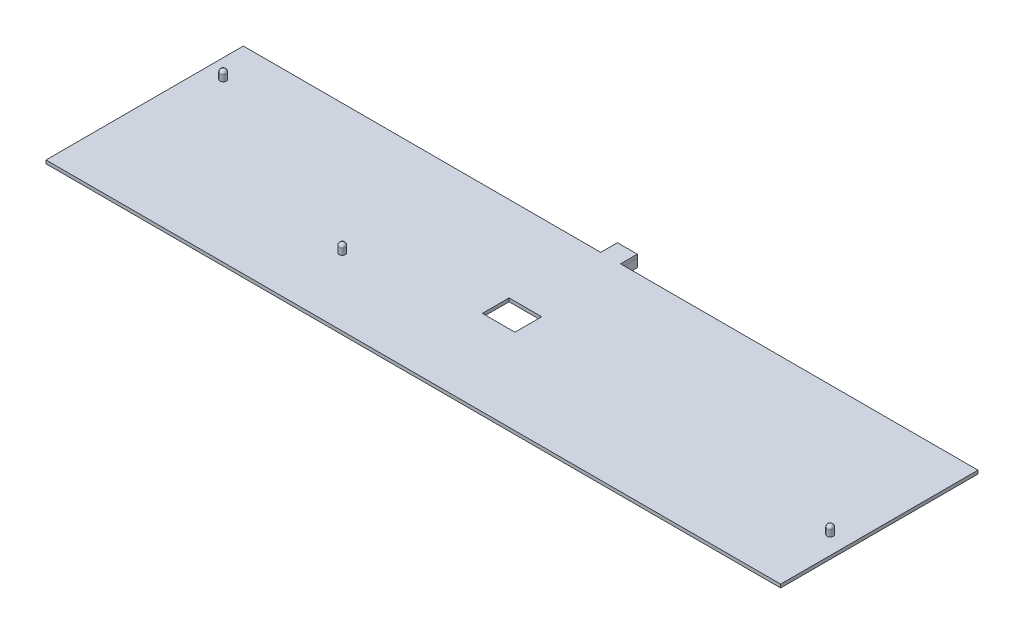
ISO-10303-21;
HEADER;
FILE_DESCRIPTION(('STEP AP214'),'2;1');
FILE_NAME('part.step','',(''),(''),'','','');
FILE_SCHEMA(('AUTOMOTIVE_DESIGN { 1 0 10303 214 1 1 1 1 }'));
ENDSEC;
DATA;
#1=APPLICATION_CONTEXT('core data for automotive mechanical design processes');
#2=APPLICATION_PROTOCOL_DEFINITION('international standard','automotive_design',2000,#1);
#3=PRODUCT_CONTEXT('',#1,'mechanical');
#4=PRODUCT('Part','Part','',(#3));
#5=PRODUCT_RELATED_PRODUCT_CATEGORY('part','',(#4));
#6=PRODUCT_DEFINITION_FORMATION('','',#4);
#7=PRODUCT_DEFINITION_CONTEXT('part definition',#1,'design');
#8=PRODUCT_DEFINITION('design','',#6,#7);
#9=PRODUCT_DEFINITION_SHAPE('','',#8);
#10=(LENGTH_UNIT() NAMED_UNIT(*) SI_UNIT(.MILLI.,.METRE.));
#11=(NAMED_UNIT(*) PLANE_ANGLE_UNIT() SI_UNIT($,.RADIAN.));
#12=(NAMED_UNIT(*) SI_UNIT($,.STERADIAN.) SOLID_ANGLE_UNIT());
#13=UNCERTAINTY_MEASURE_WITH_UNIT(LENGTH_MEASURE(1.E-05),#10,'distance_accuracy_value','');
#14=(GEOMETRIC_REPRESENTATION_CONTEXT(3) GLOBAL_UNCERTAINTY_ASSIGNED_CONTEXT((#13)) GLOBAL_UNIT_ASSIGNED_CONTEXT((#10,
#11,#12)) REPRESENTATION_CONTEXT('',''));
#15=CARTESIAN_POINT('',(0.,0.,0.));
#16=DIRECTION('',(0.,0.,1.));
#17=DIRECTION('',(1.,0.,0.));
#18=AXIS2_PLACEMENT_3D('',#15,#16,#17);
#19=CARTESIAN_POINT('',(4.75000000000005,-5.6,-55.2));
#20=DIRECTION('',(-1.,0.,0.));
#21=DIRECTION('',(0.,0.,1.));
#22=AXIS2_PLACEMENT_3D('',#19,#20,#21);
#23=PLANE('',#22);
#24=DIRECTION('',(0.,0.,1.));
#25=VECTOR('',#24,1.);
#26=CARTESIAN_POINT('',(4.75000000000005,-1.6,-55.2));
#27=LINE('',#26,#25);
#28=CARTESIAN_POINT('',(4.75000000000005,-1.6,-55.2));
#29=VERTEX_POINT('',#28);
#30=CARTESIAN_POINT('',(4.75000000000005,-1.6,-47.2));
#31=VERTEX_POINT('',#30);
#32=EDGE_CURVE('E108',#29,#31,#27,.T.);
#33=ORIENTED_EDGE('',*,*,#32,.T.);
#34=DIRECTION('',(0.,1.,0.));
#35=VECTOR('',#34,1.);
#36=CARTESIAN_POINT('',(4.75000000000005,-5.6,-47.2));
#37=LINE('',#36,#35);
#38=CARTESIAN_POINT('',(4.75000000000005,-5.6,-47.2));
#39=VERTEX_POINT('',#38);
#40=EDGE_CURVE('E12',#39,#31,#37,.T.);
#41=ORIENTED_EDGE('',*,*,#40,.F.);
#42=DIRECTION('',(0.,0.,1.));
#43=VECTOR('',#42,1.);
#44=CARTESIAN_POINT('',(4.75000000000005,-5.6,-55.2));
#45=LINE('',#44,#43);
#46=CARTESIAN_POINT('',(4.75000000000005,-5.6,-55.2));
#47=VERTEX_POINT('',#46);
#48=EDGE_CURVE('E96',#47,#39,#45,.T.);
#49=ORIENTED_EDGE('',*,*,#48,.F.);
#50=DIRECTION('',(0.,1.,0.));
#51=VECTOR('',#50,1.);
#52=CARTESIAN_POINT('',(4.75000000000005,-5.6,-55.2));
#53=LINE('',#52,#51);
#54=EDGE_CURVE('E104',#47,#29,#53,.T.);
#55=ORIENTED_EDGE('',*,*,#54,.T.);
#56=EDGE_LOOP('',(#33,#41,#49,#55));
#57=FACE_BOUND('',#56,.T.);
#58=ADVANCED_FACE('F45',(#57),#23,.F.);
#59=CARTESIAN_POINT('',(4.75000000000005,-5.6,-47.2));
#60=DIRECTION('',(0.,0.,-1.));
#61=DIRECTION('',(0.,1.,0.));
#62=AXIS2_PLACEMENT_3D('',#59,#60,#61);
#63=PLANE('',#62);
#64=DIRECTION('',(-1.,0.,0.));
#65=VECTOR('',#64,1.);
#66=CARTESIAN_POINT('',(4.75000000000005,-1.6,-47.2));
#67=LINE('',#66,#65);
#68=CARTESIAN_POINT('',(-4.74999999999995,-1.6,-47.2));
#69=VERTEX_POINT('',#68);
#70=EDGE_CURVE('E100',#31,#69,#67,.T.);
#71=ORIENTED_EDGE('',*,*,#70,.T.);
#72=DIRECTION('',(0.,1.,0.));
#73=VECTOR('',#72,1.);
#74=CARTESIAN_POINT('',(-4.74999999999995,-5.6,-47.2));
#75=LINE('',#74,#73);
#76=CARTESIAN_POINT('',(-4.74999999999995,-5.6,-47.2));
#77=VERTEX_POINT('',#76);
#78=EDGE_CURVE('E53',#77,#69,#75,.T.);
#79=ORIENTED_EDGE('',*,*,#78,.F.);
#80=DIRECTION('',(-1.,0.,0.));
#81=VECTOR('',#80,1.);
#82=CARTESIAN_POINT('',(4.75000000000005,-5.6,-47.2));
#83=LINE('',#82,#81);
#84=EDGE_CURVE('E91',#39,#77,#83,.T.);
#85=ORIENTED_EDGE('',*,*,#84,.F.);
#86=ORIENTED_EDGE('',*,*,#40,.T.);
#87=EDGE_LOOP('',(#71,#79,#85,#86));
#88=FACE_BOUND('',#87,.T.);
#89=ADVANCED_FACE('F99',(#88),#63,.F.);
#90=CARTESIAN_POINT('',(-4.74999999999995,-5.6,-47.2));
#91=DIRECTION('',(1.,0.,0.));
#92=DIRECTION('',(0.,0.,-1.));
#93=AXIS2_PLACEMENT_3D('',#90,#91,#92);
#94=PLANE('',#93);
#95=DIRECTION('',(0.,0.,-1.));
#96=VECTOR('',#95,1.);
#97=CARTESIAN_POINT('',(-4.74999999999995,-1.6,-47.2));
#98=LINE('',#97,#96);
#99=CARTESIAN_POINT('',(-4.74999999999995,-1.6,-55.2));
#100=VERTEX_POINT('',#99);
#101=EDGE_CURVE('E78',#69,#100,#98,.T.);
#102=ORIENTED_EDGE('',*,*,#101,.T.);
#103=DIRECTION('',(0.,1.,0.));
#104=VECTOR('',#103,1.);
#105=CARTESIAN_POINT('',(-4.74999999999995,-5.6,-55.2));
#106=LINE('',#105,#104);
#107=CARTESIAN_POINT('',(-4.74999999999995,-5.6,-55.2));
#108=VERTEX_POINT('',#107);
#109=EDGE_CURVE('E101',#108,#100,#106,.T.);
#110=ORIENTED_EDGE('',*,*,#109,.F.);
#111=DIRECTION('',(0.,0.,-1.));
#112=VECTOR('',#111,1.);
#113=CARTESIAN_POINT('',(-4.74999999999995,-5.6,-47.2));
#114=LINE('',#113,#112);
#115=EDGE_CURVE('E94',#77,#108,#114,.T.);
#116=ORIENTED_EDGE('',*,*,#115,.F.);
#117=ORIENTED_EDGE('',*,*,#78,.T.);
#118=EDGE_LOOP('',(#102,#110,#116,#117));
#119=FACE_BOUND('',#118,.T.);
#120=ADVANCED_FACE('F102',(#119),#94,.F.);
#121=CARTESIAN_POINT('',(-4.74999999999995,-5.6,-55.2));
#122=DIRECTION('',(0.,0.,1.));
#123=DIRECTION('',(0.,-1.,0.));
#124=AXIS2_PLACEMENT_3D('',#121,#122,#123);
#125=PLANE('',#124);
#126=DIRECTION('',(1.,0.,0.));
#127=VECTOR('',#126,1.);
#128=CARTESIAN_POINT('',(-4.74999999999995,-1.6,-55.2));
#129=LINE('',#128,#127);
#130=EDGE_CURVE('E84',#100,#29,#129,.T.);
#131=ORIENTED_EDGE('',*,*,#130,.T.);
#132=ORIENTED_EDGE('',*,*,#54,.F.);
#133=DIRECTION('',(1.,0.,0.));
#134=VECTOR('',#133,1.);
#135=CARTESIAN_POINT('',(-4.74999999999995,-5.6,-55.2));
#136=LINE('',#135,#134);
#137=EDGE_CURVE('E61',#108,#47,#136,.T.);
#138=ORIENTED_EDGE('',*,*,#137,.F.);
#139=ORIENTED_EDGE('',*,*,#109,.T.);
#140=EDGE_LOOP('',(#131,#132,#138,#139));
#141=FACE_BOUND('',#140,.T.);
#142=ADVANCED_FACE('F115',(#141),#125,.F.);
#143=CARTESIAN_POINT('',(0.,-5.6,0.));
#144=DIRECTION('',(0.,-1.,0.));
#145=DIRECTION('',(0.,0.,-1.));
#146=AXIS2_PLACEMENT_3D('',#143,#144,#145);
#147=PLANE('',#146);
#148=ORIENTED_EDGE('',*,*,#48,.T.);
#149=ORIENTED_EDGE('',*,*,#84,.T.);
#150=ORIENTED_EDGE('',*,*,#115,.T.);
#151=ORIENTED_EDGE('',*,*,#137,.T.);
#152=EDGE_LOOP('',(#148,#149,#150,#151));
#153=FACE_BOUND('',#152,.T.);
#154=ADVANCED_FACE('F92',(#153),#147,.T.);
#155=CARTESIAN_POINT('',(0.,-1.6,0.));
#156=DIRECTION('',(0.,-1.,0.));
#157=DIRECTION('',(0.,0.,-1.));
#158=AXIS2_PLACEMENT_3D('',#155,#156,#157);
#159=PLANE('',#158);
#160=ORIENTED_EDGE('',*,*,#32,.F.);
#161=ORIENTED_EDGE('',*,*,#130,.F.);
#162=ORIENTED_EDGE('',*,*,#101,.F.);
#163=ORIENTED_EDGE('',*,*,#70,.F.);
#164=EDGE_LOOP('',(#160,#161,#162,#163));
#165=FACE_BOUND('',#164,.T.);
#166=ADVANCED_FACE('F118',(#165),#159,.F.);
#167=CLOSED_SHELL('',(#58,#89,#120,#142,#154,#166));
#168=MANIFOLD_SOLID_BREP('B2',#167);
#169=CARTESIAN_POINT('',(4.75000000000005,-1.6,-47.2));
#170=DIRECTION('',(0.,0.,-1.));
#171=DIRECTION('',(-1.,0.,0.));
#172=AXIS2_PLACEMENT_3D('',#169,#170,#171);
#173=PLANE('',#172);
#174=DIRECTION('',(-1.,0.,0.));
#175=VECTOR('',#174,1.);
#176=CARTESIAN_POINT('',(4.75000000000005,0.,-47.2));
#177=LINE('',#176,#175);
#178=CARTESIAN_POINT('',(175.7,0.,-47.2));
#179=VERTEX_POINT('',#178);
#180=CARTESIAN_POINT('',(4.75000000000005,0.,-47.2));
#181=VERTEX_POINT('',#180);
#182=EDGE_CURVE('E296',#179,#181,#177,.T.);
#183=ORIENTED_EDGE('',*,*,#182,.F.);
#184=DIRECTION('',(0.,1.,0.));
#185=VECTOR('',#184,1.);
#186=CARTESIAN_POINT('',(175.7,-1.6,-47.2));
#187=LINE('',#186,#185);
#188=CARTESIAN_POINT('',(175.7,-1.6,-47.2));
#189=VERTEX_POINT('',#188);
#190=EDGE_CURVE('E43',#189,#179,#187,.T.);
#191=ORIENTED_EDGE('',*,*,#190,.F.);
#192=DIRECTION('',(-1.,0.,0.));
#193=VECTOR('',#192,1.);
#194=CARTESIAN_POINT('',(4.75000000000005,-1.6,-47.2));
#195=LINE('',#194,#193);
#196=CARTESIAN_POINT('',(4.75000000000005,-1.6,-47.2));
#197=VERTEX_POINT('',#196);
#198=EDGE_CURVE('E300',#189,#197,#195,.T.);
#199=ORIENTED_EDGE('',*,*,#198,.T.);
#200=DIRECTION('',(0.,1.,0.));
#201=VECTOR('',#200,1.);
#202=CARTESIAN_POINT('',(4.75000000000005,-1.6,-47.2));
#203=LINE('',#202,#201);
#204=EDGE_CURVE('E325',#197,#181,#203,.T.);
#205=ORIENTED_EDGE('',*,*,#204,.T.);
#206=EDGE_LOOP('',(#183,#191,#199,#205));
#207=FACE_BOUND('',#206,.T.);
#208=ADVANCED_FACE('F169',(#207),#173,.T.);
#209=CARTESIAN_POINT('',(175.7,-1.6,47.2));
#210=DIRECTION('',(1.,0.,0.));
#211=DIRECTION('',(0.,0.,-1.));
#212=AXIS2_PLACEMENT_3D('',#209,#210,#211);
#213=PLANE('',#212);
#214=DIRECTION('',(0.,0.,-1.));
#215=VECTOR('',#214,1.);
#216=CARTESIAN_POINT('',(175.7,0.,47.2));
#217=LINE('',#216,#215);
#218=CARTESIAN_POINT('',(175.7,0.,47.2));
#219=VERTEX_POINT('',#218);
#220=EDGE_CURVE('E304',#219,#179,#217,.T.);
#221=ORIENTED_EDGE('',*,*,#220,.F.);
#222=DIRECTION('',(0.,1.,0.));
#223=VECTOR('',#222,1.);
#224=CARTESIAN_POINT('',(175.7,-1.6,47.2));
#225=LINE('',#224,#223);
#226=CARTESIAN_POINT('',(175.7,-1.6,47.2));
#227=VERTEX_POINT('',#226);
#228=EDGE_CURVE('E178',#227,#219,#225,.T.);
#229=ORIENTED_EDGE('',*,*,#228,.F.);
#230=DIRECTION('',(0.,0.,-1.));
#231=VECTOR('',#230,1.);
#232=CARTESIAN_POINT('',(175.7,-1.6,47.2));
#233=LINE('',#232,#231);
#234=EDGE_CURVE('E322',#227,#189,#233,.T.);
#235=ORIENTED_EDGE('',*,*,#234,.T.);
#236=ORIENTED_EDGE('',*,*,#190,.T.);
#237=EDGE_LOOP('',(#221,#229,#235,#236));
#238=FACE_BOUND('',#237,.T.);
#239=ADVANCED_FACE('F414',(#238),#213,.T.);
#240=CARTESIAN_POINT('',(-175.7,-1.6,47.2));
#241=DIRECTION('',(0.,0.,1.));
#242=DIRECTION('',(1.,0.,0.));
#243=AXIS2_PLACEMENT_3D('',#240,#241,#242);
#244=PLANE('',#243);
#245=DIRECTION('',(1.,0.,0.));
#246=VECTOR('',#245,1.);
#247=CARTESIAN_POINT('',(-175.7,0.,47.2));
#248=LINE('',#247,#246);
#249=CARTESIAN_POINT('',(-175.7,0.,47.2));
#250=VERTEX_POINT('',#249);
#251=EDGE_CURVE('E343',#250,#219,#248,.T.);
#252=ORIENTED_EDGE('',*,*,#251,.F.);
#253=DIRECTION('',(0.,1.,0.));
#254=VECTOR('',#253,1.);
#255=CARTESIAN_POINT('',(-175.7,-1.6,47.2));
#256=LINE('',#255,#254);
#257=CARTESIAN_POINT('',(-175.7,-1.6,47.2));
#258=VERTEX_POINT('',#257);
#259=EDGE_CURVE('E349',#258,#250,#256,.T.);
#260=ORIENTED_EDGE('',*,*,#259,.F.);
#261=DIRECTION('',(1.,0.,0.));
#262=VECTOR('',#261,1.);
#263=CARTESIAN_POINT('',(-175.7,-1.6,47.2));
#264=LINE('',#263,#262);
#265=EDGE_CURVE('E319',#258,#227,#264,.T.);
#266=ORIENTED_EDGE('',*,*,#265,.T.);
#267=ORIENTED_EDGE('',*,*,#228,.T.);
#268=EDGE_LOOP('',(#252,#260,#266,#267));
#269=FACE_BOUND('',#268,.T.);
#270=ADVANCED_FACE('F417',(#269),#244,.T.);
#271=CARTESIAN_POINT('',(-175.7,-1.6,47.2));
#272=DIRECTION('',(-1.,0.,0.));
#273=DIRECTION('',(0.,0.,1.));
#274=AXIS2_PLACEMENT_3D('',#271,#272,#273);
#275=PLANE('',#274);
#276=DIRECTION('',(0.,0.,1.));
#277=VECTOR('',#276,1.);
#278=CARTESIAN_POINT('',(-175.7,0.,47.2));
#279=LINE('',#278,#277);
#280=CARTESIAN_POINT('',(-175.7,0.,-47.2));
#281=VERTEX_POINT('',#280);
#282=EDGE_CURVE('E340',#281,#250,#279,.T.);
#283=ORIENTED_EDGE('',*,*,#282,.F.);
#284=DIRECTION('',(0.,1.,0.));
#285=VECTOR('',#284,1.);
#286=CARTESIAN_POINT('',(-175.7,-1.6,-47.2));
#287=LINE('',#286,#285);
#288=CARTESIAN_POINT('',(-175.7,-1.6,-47.2));
#289=VERTEX_POINT('',#288);
#290=EDGE_CURVE('E351',#289,#281,#287,.T.);
#291=ORIENTED_EDGE('',*,*,#290,.F.);
#292=DIRECTION('',(0.,0.,1.));
#293=VECTOR('',#292,1.);
#294=CARTESIAN_POINT('',(-175.7,-1.6,47.2));
#295=LINE('',#294,#293);
#296=EDGE_CURVE('E316',#289,#258,#295,.T.);
#297=ORIENTED_EDGE('',*,*,#296,.T.);
#298=ORIENTED_EDGE('',*,*,#259,.T.);
#299=EDGE_LOOP('',(#283,#291,#297,#298));
#300=FACE_BOUND('',#299,.T.);
#301=ADVANCED_FACE('F410',(#300),#275,.T.);
#302=CARTESIAN_POINT('',(-175.7,-1.6,-47.2));
#303=DIRECTION('',(0.,0.,-1.));
#304=DIRECTION('',(-1.,0.,0.));
#305=AXIS2_PLACEMENT_3D('',#302,#303,#304);
#306=PLANE('',#305);
#307=DIRECTION('',(-1.,0.,0.));
#308=VECTOR('',#307,1.);
#309=CARTESIAN_POINT('',(-175.7,0.,-47.2));
#310=LINE('',#309,#308);
#311=CARTESIAN_POINT('',(-4.74999999999995,0.,-47.2));
#312=VERTEX_POINT('',#311);
#313=EDGE_CURVE('E337',#312,#281,#310,.T.);
#314=ORIENTED_EDGE('',*,*,#313,.F.);
#315=DIRECTION('',(0.,1.,0.));
#316=VECTOR('',#315,1.);
#317=CARTESIAN_POINT('',(-4.74999999999995,-1.6,-47.2));
#318=LINE('',#317,#316);
#319=CARTESIAN_POINT('',(-4.74999999999995,-1.6,-47.2));
#320=VERTEX_POINT('',#319);
#321=EDGE_CURVE('E353',#320,#312,#318,.T.);
#322=ORIENTED_EDGE('',*,*,#321,.F.);
#323=DIRECTION('',(-1.,0.,0.));
#324=VECTOR('',#323,1.);
#325=CARTESIAN_POINT('',(-175.7,-1.6,-47.2));
#326=LINE('',#325,#324);
#327=EDGE_CURVE('E313',#320,#289,#326,.T.);
#328=ORIENTED_EDGE('',*,*,#327,.T.);
#329=ORIENTED_EDGE('',*,*,#290,.T.);
#330=EDGE_LOOP('',(#314,#322,#328,#329));
#331=FACE_BOUND('',#330,.T.);
#332=ADVANCED_FACE('F406',(#331),#306,.T.);
#333=CARTESIAN_POINT('',(-4.74999999999995,-1.6,-47.2));
#334=DIRECTION('',(-1.,0.,0.));
#335=DIRECTION('',(0.,0.,1.));
#336=AXIS2_PLACEMENT_3D('',#333,#334,#335);
#337=PLANE('',#336);
#338=DIRECTION('',(0.,0.,1.));
#339=VECTOR('',#338,1.);
#340=CARTESIAN_POINT('',(-4.74999999999995,0.,-47.2));
#341=LINE('',#340,#339);
#342=CARTESIAN_POINT('',(-4.74999999999995,0.,-55.2));
#343=VERTEX_POINT('',#342);
#344=EDGE_CURVE('E334',#343,#312,#341,.T.);
#345=ORIENTED_EDGE('',*,*,#344,.F.);
#346=DIRECTION('',(0.,1.,0.));
#347=VECTOR('',#346,1.);
#348=CARTESIAN_POINT('',(-4.74999999999995,-1.6,-55.2));
#349=LINE('',#348,#347);
#350=CARTESIAN_POINT('',(-4.74999999999995,-1.6,-55.2));
#351=VERTEX_POINT('',#350);
#352=EDGE_CURVE('E355',#351,#343,#349,.T.);
#353=ORIENTED_EDGE('',*,*,#352,.F.);
#354=DIRECTION('',(0.,0.,1.));
#355=VECTOR('',#354,1.);
#356=CARTESIAN_POINT('',(-4.74999999999995,-1.6,-47.2));
#357=LINE('',#356,#355);
#358=EDGE_CURVE('E310',#351,#320,#357,.T.);
#359=ORIENTED_EDGE('',*,*,#358,.T.);
#360=ORIENTED_EDGE('',*,*,#321,.T.);
#361=EDGE_LOOP('',(#345,#353,#359,#360));
#362=FACE_BOUND('',#361,.T.);
#363=ADVANCED_FACE('F402',(#362),#337,.T.);
#364=CARTESIAN_POINT('',(-4.74999999999995,-1.6,-55.2));
#365=DIRECTION('',(0.,0.,-1.));
#366=DIRECTION('',(-1.,0.,0.));
#367=AXIS2_PLACEMENT_3D('',#364,#365,#366);
#368=PLANE('',#367);
#369=DIRECTION('',(-1.,0.,0.));
#370=VECTOR('',#369,1.);
#371=CARTESIAN_POINT('',(-4.74999999999995,0.,-55.2));
#372=LINE('',#371,#370);
#373=CARTESIAN_POINT('',(4.75000000000005,0.,-55.2));
#374=VERTEX_POINT('',#373);
#375=EDGE_CURVE('E331',#374,#343,#372,.T.);
#376=ORIENTED_EDGE('',*,*,#375,.F.);
#377=DIRECTION('',(0.,1.,0.));
#378=VECTOR('',#377,1.);
#379=CARTESIAN_POINT('',(4.75000000000005,-1.6,-55.2));
#380=LINE('',#379,#378);
#381=CARTESIAN_POINT('',(4.75000000000005,-1.6,-55.2));
#382=VERTEX_POINT('',#381);
#383=EDGE_CURVE('E357',#382,#374,#380,.T.);
#384=ORIENTED_EDGE('',*,*,#383,.F.);
#385=DIRECTION('',(-1.,0.,0.));
#386=VECTOR('',#385,1.);
#387=CARTESIAN_POINT('',(-4.74999999999995,-1.6,-55.2));
#388=LINE('',#387,#386);
#389=EDGE_CURVE('E307',#382,#351,#388,.T.);
#390=ORIENTED_EDGE('',*,*,#389,.T.);
#391=ORIENTED_EDGE('',*,*,#352,.T.);
#392=EDGE_LOOP('',(#376,#384,#390,#391));
#393=FACE_BOUND('',#392,.T.);
#394=ADVANCED_FACE('F398',(#393),#368,.T.);
#395=CARTESIAN_POINT('',(4.75000000000005,-1.6,-47.2));
#396=DIRECTION('',(1.,0.,0.));
#397=DIRECTION('',(0.,0.,-1.));
#398=AXIS2_PLACEMENT_3D('',#395,#396,#397);
#399=PLANE('',#398);
#400=DIRECTION('',(0.,0.,-1.));
#401=VECTOR('',#400,1.);
#402=CARTESIAN_POINT('',(4.75000000000005,0.,-47.2));
#403=LINE('',#402,#401);
#404=EDGE_CURVE('E328',#181,#374,#403,.T.);
#405=ORIENTED_EDGE('',*,*,#404,.F.);
#406=ORIENTED_EDGE('',*,*,#204,.F.);
#407=DIRECTION('',(0.,0.,-1.));
#408=VECTOR('',#407,1.);
#409=CARTESIAN_POINT('',(4.75000000000005,-1.6,-47.2));
#410=LINE('',#409,#408);
#411=EDGE_CURVE('E303',#197,#382,#410,.T.);
#412=ORIENTED_EDGE('',*,*,#411,.T.);
#413=ORIENTED_EDGE('',*,*,#383,.T.);
#414=EDGE_LOOP('',(#405,#406,#412,#413));
#415=FACE_BOUND('',#414,.T.);
#416=ADVANCED_FACE('F394',(#415),#399,.T.);
#417=CARTESIAN_POINT('',(0.,-1.6,0.));
#418=DIRECTION('',(0.,1.,0.));
#419=DIRECTION('',(0.,0.,1.));
#420=AXIS2_PLACEMENT_3D('',#417,#418,#419);
#421=PLANE('',#420);
#422=DIRECTION('',(1.,0.,0.));
#423=VECTOR('',#422,1.);
#424=CARTESIAN_POINT('',(-7.79999999999995,-1.6,6.4));
#425=LINE('',#424,#423);
#426=CARTESIAN_POINT('',(-7.79999999999995,-1.6,6.4));
#427=VERTEX_POINT('',#426);
#428=CARTESIAN_POINT('',(7.80000000000005,-1.6,6.4));
#429=VERTEX_POINT('',#428);
#430=EDGE_CURVE('E267',#427,#429,#425,.T.);
#431=ORIENTED_EDGE('',*,*,#430,.T.);
#432=DIRECTION('',(0.,0.,-1.));
#433=VECTOR('',#432,1.);
#434=CARTESIAN_POINT('',(7.80000000000005,-1.6,6.4));
#435=LINE('',#434,#433);
#436=CARTESIAN_POINT('',(7.80000000000005,-1.6,-6.4));
#437=VERTEX_POINT('',#436);
#438=EDGE_CURVE('E261',#429,#437,#435,.T.);
#439=ORIENTED_EDGE('',*,*,#438,.T.);
#440=DIRECTION('',(-1.,0.,0.));
#441=VECTOR('',#440,1.);
#442=CARTESIAN_POINT('',(-7.79999999999995,-1.6,-6.4));
#443=LINE('',#442,#441);
#444=CARTESIAN_POINT('',(-7.79999999999995,-1.6,-6.4));
#445=VERTEX_POINT('',#444);
#446=EDGE_CURVE('E270',#437,#445,#443,.T.);
#447=ORIENTED_EDGE('',*,*,#446,.T.);
#448=DIRECTION('',(0.,0.,1.));
#449=VECTOR('',#448,1.);
#450=CARTESIAN_POINT('',(-7.79999999999995,-1.6,6.4));
#451=LINE('',#450,#449);
#452=EDGE_CURVE('E186',#445,#427,#451,.T.);
#453=ORIENTED_EDGE('',*,*,#452,.T.);
#454=EDGE_LOOP('',(#431,#439,#447,#453));
#455=FACE_BOUND('',#454,.T.);
#456=ORIENTED_EDGE('',*,*,#198,.F.);
#457=ORIENTED_EDGE('',*,*,#234,.F.);
#458=ORIENTED_EDGE('',*,*,#265,.F.);
#459=ORIENTED_EDGE('',*,*,#296,.F.);
#460=ORIENTED_EDGE('',*,*,#327,.F.);
#461=ORIENTED_EDGE('',*,*,#358,.F.);
#462=ORIENTED_EDGE('',*,*,#389,.F.);
#463=ORIENTED_EDGE('',*,*,#411,.F.);
#464=EDGE_LOOP('',(#456,#457,#458,#459,#460,#461,#462,#463));
#465=FACE_BOUND('',#464,.T.);
#466=ADVANCED_FACE('F274',(#455,#465),#421,.F.);
#467=CARTESIAN_POINT('',(0.,0.,0.));
#468=DIRECTION('',(0.,1.,0.));
#469=DIRECTION('',(0.,0.,1.));
#470=AXIS2_PLACEMENT_3D('',#467,#468,#469);
#471=PLANE('',#470);
#472=CARTESIAN_POINT('',(166.981249999994,0.,14.7999999999999));
#473=DIRECTION('',(0.,1.,0.));
#474=DIRECTION('',(0.,0.,1.));
#475=AXIS2_PLACEMENT_3D('',#472,#473,#474);
#476=CIRCLE('',#475,1.5);
#477=CARTESIAN_POINT('',(166.981249999994,0.,16.2999999999999));
#478=VERTEX_POINT('',#477);
#479=EDGE_CURVE('E371',#478,#478,#476,.T.);
#480=ORIENTED_EDGE('',*,*,#479,.F.);
#481=EDGE_LOOP('',(#480));
#482=FACE_BOUND('',#481,.T.);
#483=CARTESIAN_POINT('',(-66.381250000005,0.,14.7999999999999));
#484=DIRECTION('',(0.,1.,0.));
#485=DIRECTION('',(0.,0.,1.));
#486=AXIS2_PLACEMENT_3D('',#483,#484,#485);
#487=CIRCLE('',#486,1.5);
#488=CARTESIAN_POINT('',(-66.381250000005,0.,16.2999999999999));
#489=VERTEX_POINT('',#488);
#490=EDGE_CURVE('E363',#489,#489,#487,.T.);
#491=ORIENTED_EDGE('',*,*,#490,.F.);
#492=EDGE_LOOP('',(#491));
#493=FACE_BOUND('',#492,.T.);
#494=CARTESIAN_POINT('',(-166.737500000004,0.,-28.5750000000002));
#495=DIRECTION('',(0.,1.,0.));
#496=DIRECTION('',(0.,0.,1.));
#497=AXIS2_PLACEMENT_3D('',#494,#495,#496);
#498=CIRCLE('',#497,1.5);
#499=CARTESIAN_POINT('',(-166.737500000004,0.,-27.0750000000002));
#500=VERTEX_POINT('',#499);
#501=EDGE_CURVE('E283',#500,#500,#498,.T.);
#502=ORIENTED_EDGE('',*,*,#501,.F.);
#503=EDGE_LOOP('',(#502));
#504=FACE_BOUND('',#503,.T.);
#505=DIRECTION('',(0.,0.,-1.));
#506=VECTOR('',#505,1.);
#507=CARTESIAN_POINT('',(7.80000000000005,0.,6.4));
#508=LINE('',#507,#506);
#509=CARTESIAN_POINT('',(7.80000000000005,0.,6.4));
#510=VERTEX_POINT('',#509);
#511=CARTESIAN_POINT('',(7.80000000000005,0.,-6.4));
#512=VERTEX_POINT('',#511);
#513=EDGE_CURVE('E194',#510,#512,#508,.T.);
#514=ORIENTED_EDGE('',*,*,#513,.F.);
#515=DIRECTION('',(1.,0.,0.));
#516=VECTOR('',#515,1.);
#517=CARTESIAN_POINT('',(-7.79999999999995,0.,6.4));
#518=LINE('',#517,#516);
#519=CARTESIAN_POINT('',(-7.79999999999995,0.,6.4));
#520=VERTEX_POINT('',#519);
#521=EDGE_CURVE('E277',#520,#510,#518,.T.);
#522=ORIENTED_EDGE('',*,*,#521,.F.);
#523=DIRECTION('',(0.,0.,1.));
#524=VECTOR('',#523,1.);
#525=CARTESIAN_POINT('',(-7.79999999999995,0.,6.4));
#526=LINE('',#525,#524);
#527=CARTESIAN_POINT('',(-7.79999999999995,0.,-6.4));
#528=VERTEX_POINT('',#527);
#529=EDGE_CURVE('E280',#528,#520,#526,.T.);
#530=ORIENTED_EDGE('',*,*,#529,.F.);
#531=DIRECTION('',(-1.,0.,0.));
#532=VECTOR('',#531,1.);
#533=CARTESIAN_POINT('',(-7.79999999999995,0.,-6.4));
#534=LINE('',#533,#532);
#535=EDGE_CURVE('E289',#512,#528,#534,.T.);
#536=ORIENTED_EDGE('',*,*,#535,.F.);
#537=EDGE_LOOP('',(#514,#522,#530,#536));
#538=FACE_BOUND('',#537,.T.);
#539=ORIENTED_EDGE('',*,*,#182,.T.);
#540=ORIENTED_EDGE('',*,*,#404,.T.);
#541=ORIENTED_EDGE('',*,*,#375,.T.);
#542=ORIENTED_EDGE('',*,*,#344,.T.);
#543=ORIENTED_EDGE('',*,*,#313,.T.);
#544=ORIENTED_EDGE('',*,*,#282,.T.);
#545=ORIENTED_EDGE('',*,*,#251,.T.);
#546=ORIENTED_EDGE('',*,*,#220,.T.);
#547=EDGE_LOOP('',(#539,#540,#541,#542,#543,#544,#545,#546));
#548=FACE_BOUND('',#547,.T.);
#549=ADVANCED_FACE('F378',(#482,#493,#504,#538,#548),#471,.T.);
#550=CARTESIAN_POINT('',(7.80000000000005,-1.6,6.4));
#551=DIRECTION('',(1.,0.,0.));
#552=DIRECTION('',(0.,0.,-1.));
#553=AXIS2_PLACEMENT_3D('',#550,#551,#552);
#554=PLANE('',#553);
#555=ORIENTED_EDGE('',*,*,#513,.T.);
#556=DIRECTION('',(0.,1.,0.));
#557=VECTOR('',#556,1.);
#558=CARTESIAN_POINT('',(7.80000000000005,-1.6,-6.4));
#559=LINE('',#558,#557);
#560=EDGE_CURVE('E257',#437,#512,#559,.T.);
#561=ORIENTED_EDGE('',*,*,#560,.F.);
#562=ORIENTED_EDGE('',*,*,#438,.F.);
#563=DIRECTION('',(0.,1.,0.));
#564=VECTOR('',#563,1.);
#565=CARTESIAN_POINT('',(7.80000000000005,-1.6,6.4));
#566=LINE('',#565,#564);
#567=EDGE_CURVE('E294',#429,#510,#566,.T.);
#568=ORIENTED_EDGE('',*,*,#567,.T.);
#569=EDGE_LOOP('',(#555,#561,#562,#568));
#570=FACE_BOUND('',#569,.T.);
#571=ADVANCED_FACE('F259',(#570),#554,.F.);
#572=CARTESIAN_POINT('',(-7.79999999999995,-1.6,6.4));
#573=DIRECTION('',(0.,0.,1.));
#574=DIRECTION('',(1.,0.,0.));
#575=AXIS2_PLACEMENT_3D('',#572,#573,#574);
#576=PLANE('',#575);
#577=ORIENTED_EDGE('',*,*,#521,.T.);
#578=ORIENTED_EDGE('',*,*,#567,.F.);
#579=ORIENTED_EDGE('',*,*,#430,.F.);
#580=DIRECTION('',(0.,1.,0.));
#581=VECTOR('',#580,1.);
#582=CARTESIAN_POINT('',(-7.79999999999995,-1.6,6.4));
#583=LINE('',#582,#581);
#584=EDGE_CURVE('E297',#427,#520,#583,.T.);
#585=ORIENTED_EDGE('',*,*,#584,.T.);
#586=EDGE_LOOP('',(#577,#578,#579,#585));
#587=FACE_BOUND('',#586,.T.);
#588=ADVANCED_FACE('F454',(#587),#576,.F.);
#589=CARTESIAN_POINT('',(-7.79999999999995,-1.6,6.4));
#590=DIRECTION('',(-1.,0.,0.));
#591=DIRECTION('',(0.,0.,1.));
#592=AXIS2_PLACEMENT_3D('',#589,#590,#591);
#593=PLANE('',#592);
#594=ORIENTED_EDGE('',*,*,#529,.T.);
#595=ORIENTED_EDGE('',*,*,#584,.F.);
#596=ORIENTED_EDGE('',*,*,#452,.F.);
#597=DIRECTION('',(0.,1.,0.));
#598=VECTOR('',#597,1.);
#599=CARTESIAN_POINT('',(-7.79999999999995,-1.6,-6.4));
#600=LINE('',#599,#598);
#601=EDGE_CURVE('E266',#445,#528,#600,.T.);
#602=ORIENTED_EDGE('',*,*,#601,.T.);
#603=EDGE_LOOP('',(#594,#595,#596,#602));
#604=FACE_BOUND('',#603,.T.);
#605=ADVANCED_FACE('F457',(#604),#593,.F.);
#606=CARTESIAN_POINT('',(-7.79999999999995,-1.6,-6.4));
#607=DIRECTION('',(0.,0.,-1.));
#608=DIRECTION('',(-1.,0.,0.));
#609=AXIS2_PLACEMENT_3D('',#606,#607,#608);
#610=PLANE('',#609);
#611=ORIENTED_EDGE('',*,*,#535,.T.);
#612=ORIENTED_EDGE('',*,*,#601,.F.);
#613=ORIENTED_EDGE('',*,*,#446,.F.);
#614=ORIENTED_EDGE('',*,*,#560,.T.);
#615=EDGE_LOOP('',(#611,#612,#613,#614));
#616=FACE_BOUND('',#615,.T.);
#617=ADVANCED_FACE('F271',(#616),#610,.F.);
#618=CARTESIAN_POINT('',(-166.737500000004,3.,-28.5750000000002));
#619=DIRECTION('',(0.,-1.,0.));
#620=DIRECTION('',(0.,0.,-1.));
#621=AXIS2_PLACEMENT_3D('',#618,#619,#620);
#622=CYLINDRICAL_SURFACE('',#621,1.5);
#623=CARTESIAN_POINT('',(-166.737500000004,3.,-28.5750000000002));
#624=DIRECTION('',(0.,1.,0.));
#625=DIRECTION('',(0.,0.,1.));
#626=AXIS2_PLACEMENT_3D('',#623,#624,#625);
#627=CIRCLE('',#626,1.5);
#628=CARTESIAN_POINT('',(-166.737500000004,3.,-27.0750000000002));
#629=VERTEX_POINT('',#628);
#630=EDGE_CURVE('E290',#629,#629,#627,.T.);
#631=ORIENTED_EDGE('',*,*,#630,.F.);
#632=EDGE_LOOP('',(#631));
#633=FACE_BOUND('',#632,.T.);
#634=ORIENTED_EDGE('',*,*,#501,.T.);
#635=EDGE_LOOP('',(#634));
#636=FACE_BOUND('',#635,.T.);
#637=ADVANCED_FACE('F436',(#633,#636),#622,.T.);
#638=CARTESIAN_POINT('',(-166.737500000004,3.,-28.5750000000002));
#639=DIRECTION('',(0.,0.,1.));
#640=DIRECTION('',(1.,0.,0.));
#641=AXIS2_PLACEMENT_3D('',#638,#639,#640);
#642=SPHERICAL_SURFACE('',#641,1.5);
#643=CARTESIAN_POINT('',(-166.737500000004,3.,-28.5750000000002));
#644=DIRECTION('',(0.,1.,0.));
#645=DIRECTION('',(0.,0.,1.));
#646=AXIS2_PLACEMENT_3D('',#643,#644,#645);
#647=SPHERICAL_SURFACE('',#646,1.5);
#648=ORIENTED_EDGE('',*,*,#630,.T.);
#649=EDGE_LOOP('',(#648));
#650=FACE_BOUND('',#649,.T.);
#651=ADVANCED_FACE('F433',(#650),#647,.T.);
#652=CARTESIAN_POINT('',(-66.381250000005,3.,14.7999999999999));
#653=DIRECTION('',(0.,-1.,0.));
#654=DIRECTION('',(0.,0.,-1.));
#655=AXIS2_PLACEMENT_3D('',#652,#653,#654);
#656=CYLINDRICAL_SURFACE('',#655,1.5);
#657=CARTESIAN_POINT('',(-66.381250000005,3.,14.7999999999999));
#658=DIRECTION('',(0.,1.,0.));
#659=DIRECTION('',(0.,0.,1.));
#660=AXIS2_PLACEMENT_3D('',#657,#658,#659);
#661=CIRCLE('',#660,1.5);
#662=CARTESIAN_POINT('',(-66.381250000005,3.,16.2999999999999));
#663=VERTEX_POINT('',#662);
#664=EDGE_CURVE('E361',#663,#663,#661,.T.);
#665=ORIENTED_EDGE('',*,*,#664,.F.);
#666=EDGE_LOOP('',(#665));
#667=FACE_BOUND('',#666,.T.);
#668=ORIENTED_EDGE('',*,*,#490,.T.);
#669=EDGE_LOOP('',(#668));
#670=FACE_BOUND('',#669,.T.);
#671=ADVANCED_FACE('F435',(#667,#670),#656,.T.);
#672=CARTESIAN_POINT('',(-66.381250000005,3.,14.7999999999999));
#673=DIRECTION('',(0.,0.,1.));
#674=DIRECTION('',(1.,0.,0.));
#675=AXIS2_PLACEMENT_3D('',#672,#673,#674);
#676=SPHERICAL_SURFACE('',#675,1.5);
#677=CARTESIAN_POINT('',(-66.381250000005,3.,14.7999999999999));
#678=DIRECTION('',(0.,1.,0.));
#679=DIRECTION('',(0.,0.,1.));
#680=AXIS2_PLACEMENT_3D('',#677,#678,#679);
#681=SPHERICAL_SURFACE('',#680,1.5);
#682=ORIENTED_EDGE('',*,*,#664,.T.);
#683=EDGE_LOOP('',(#682));
#684=FACE_BOUND('',#683,.T.);
#685=ADVANCED_FACE('F438',(#684),#681,.T.);
#686=CARTESIAN_POINT('',(166.981249999994,3.,14.7999999999999));
#687=DIRECTION('',(0.,-1.,0.));
#688=DIRECTION('',(0.,0.,-1.));
#689=AXIS2_PLACEMENT_3D('',#686,#687,#688);
#690=CYLINDRICAL_SURFACE('',#689,1.5);
#691=CARTESIAN_POINT('',(166.981249999994,3.,14.7999999999999));
#692=DIRECTION('',(0.,1.,0.));
#693=DIRECTION('',(0.,0.,1.));
#694=AXIS2_PLACEMENT_3D('',#691,#692,#693);
#695=CIRCLE('',#694,1.5);
#696=CARTESIAN_POINT('',(166.981249999994,3.,16.2999999999999));
#697=VERTEX_POINT('',#696);
#698=EDGE_CURVE('E173',#697,#697,#695,.T.);
#699=ORIENTED_EDGE('',*,*,#698,.F.);
#700=EDGE_LOOP('',(#699));
#701=FACE_BOUND('',#700,.T.);
#702=ORIENTED_EDGE('',*,*,#479,.T.);
#703=EDGE_LOOP('',(#702));
#704=FACE_BOUND('',#703,.T.);
#705=ADVANCED_FACE('F376',(#701,#704),#690,.T.);
#706=CARTESIAN_POINT('',(166.981249999994,3.,14.7999999999999));
#707=DIRECTION('',(0.,0.,1.));
#708=DIRECTION('',(1.,0.,0.));
#709=AXIS2_PLACEMENT_3D('',#706,#707,#708);
#710=SPHERICAL_SURFACE('',#709,1.5);
#711=CARTESIAN_POINT('',(166.981249999994,3.,14.7999999999999));
#712=DIRECTION('',(0.,1.,0.));
#713=DIRECTION('',(0.,0.,1.));
#714=AXIS2_PLACEMENT_3D('',#711,#712,#713);
#715=SPHERICAL_SURFACE('',#714,1.5);
#716=ORIENTED_EDGE('',*,*,#698,.T.);
#717=EDGE_LOOP('',(#716));
#718=FACE_BOUND('',#717,.T.);
#719=ADVANCED_FACE('F171',(#718),#715,.T.);
#720=CLOSED_SHELL('',(#208,#239,#270,#301,#332,#363,#394,#416,#466,#549,#571,#588,#605,#617,
#637,#651,#671,#685,#705,#719));
#721=MANIFOLD_SOLID_BREP('B6',#720);
#722=ADVANCED_BREP_SHAPE_REPRESENTATION('',(#18,#168,#721),#14);
#723=SHAPE_DEFINITION_REPRESENTATION(#9,#722);
ENDSEC;
END-ISO-10303-21;
